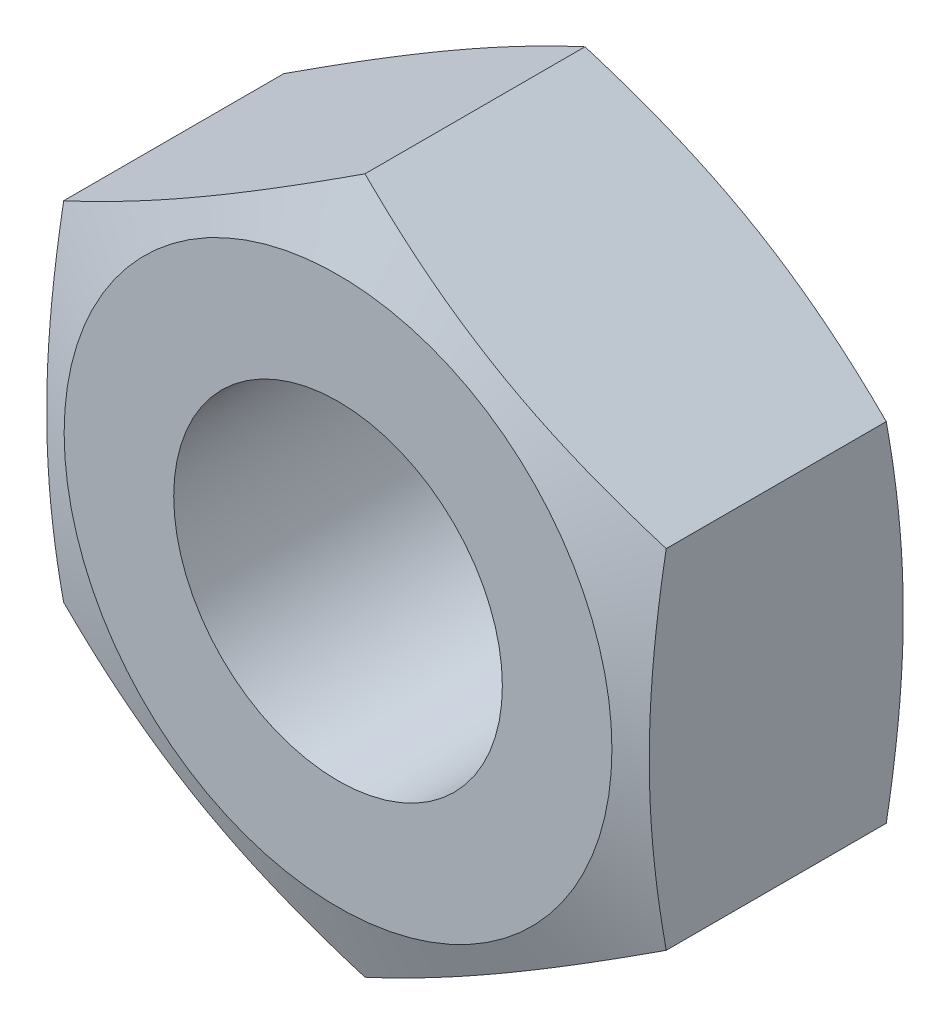
ISO-10303-21;
HEADER;
FILE_DESCRIPTION(('STEP AP214'),'2;1');
FILE_NAME('part.step','',(''),(''),'','','');
FILE_SCHEMA(('AUTOMOTIVE_DESIGN { 1 0 10303 214 1 1 1 1 }'));
ENDSEC;
DATA;
#1=APPLICATION_CONTEXT('core data for automotive mechanical design processes');
#2=APPLICATION_PROTOCOL_DEFINITION('international standard','automotive_design',2000,#1);
#3=PRODUCT_CONTEXT('',#1,'mechanical');
#4=PRODUCT('Part','Part','',(#3));
#5=PRODUCT_RELATED_PRODUCT_CATEGORY('part','',(#4));
#6=PRODUCT_DEFINITION_FORMATION('','',#4);
#7=PRODUCT_DEFINITION_CONTEXT('part definition',#1,'design');
#8=PRODUCT_DEFINITION('design','',#6,#7);
#9=PRODUCT_DEFINITION_SHAPE('','',#8);
#10=(LENGTH_UNIT() NAMED_UNIT(*) SI_UNIT(.MILLI.,.METRE.));
#11=(NAMED_UNIT(*) PLANE_ANGLE_UNIT() SI_UNIT($,.RADIAN.));
#12=(NAMED_UNIT(*) SI_UNIT($,.STERADIAN.) SOLID_ANGLE_UNIT());
#13=UNCERTAINTY_MEASURE_WITH_UNIT(LENGTH_MEASURE(1.E-05),#10,'distance_accuracy_value','');
#14=(GEOMETRIC_REPRESENTATION_CONTEXT(3) GLOBAL_UNCERTAINTY_ASSIGNED_CONTEXT((#13)) GLOBAL_UNIT_ASSIGNED_CONTEXT((#10,
#11,#12)) REPRESENTATION_CONTEXT('',''));
#15=CARTESIAN_POINT('',(0.,0.,0.));
#16=DIRECTION('',(0.,0.,1.));
#17=DIRECTION('',(1.,0.,0.));
#18=AXIS2_PLACEMENT_3D('',#15,#16,#17);
#19=CARTESIAN_POINT('',(0.,0.,-1.25));
#20=DIRECTION('',(0.,0.,1.));
#21=DIRECTION('',(1.,0.,0.));
#22=AXIS2_PLACEMENT_3D('',#19,#20,#21);
#23=PLANE('',#22);
#24=CARTESIAN_POINT('',(0.,0.,-1.25));
#25=DIRECTION('',(0.,0.,1.));
#26=DIRECTION('',(1.,0.,0.));
#27=AXIS2_PLACEMENT_3D('',#24,#25,#26);
#28=CIRCLE('',#27,1.5);
#29=CARTESIAN_POINT('',(1.5,0.,-1.25));
#30=VERTEX_POINT('',#29);
#31=EDGE_CURVE('E217',#30,#30,#28,.T.);
#32=ORIENTED_EDGE('',*,*,#31,.T.);
#33=EDGE_LOOP('',(#32));
#34=FACE_BOUND('',#33,.T.);
#35=CARTESIAN_POINT('',(0.,0.,-1.25));
#36=DIRECTION('',(0.,0.,1.));
#37=DIRECTION('',(1.,0.,0.));
#38=AXIS2_PLACEMENT_3D('',#35,#36,#37);
#39=CIRCLE('',#38,2.5);
#40=CARTESIAN_POINT('',(2.5,0.,-1.25));
#41=VERTEX_POINT('',#40);
#42=EDGE_CURVE('E100',#41,#41,#39,.T.);
#43=ORIENTED_EDGE('',*,*,#42,.F.);
#44=EDGE_LOOP('',(#43));
#45=FACE_BOUND('',#44,.T.);
#46=ADVANCED_FACE('F35',(#34,#45),#23,.F.);
#47=CARTESIAN_POINT('',(0.,0.,1.25));
#48=DIRECTION('',(0.,0.,1.));
#49=DIRECTION('',(1.,0.,0.));
#50=AXIS2_PLACEMENT_3D('',#47,#48,#49);
#51=PLANE('',#50);
#52=CARTESIAN_POINT('',(0.,0.,1.25));
#53=DIRECTION('',(0.,0.,1.));
#54=DIRECTION('',(1.,0.,0.));
#55=AXIS2_PLACEMENT_3D('',#52,#53,#54);
#56=CIRCLE('',#55,1.5);
#57=CARTESIAN_POINT('',(1.5,0.,1.25));
#58=VERTEX_POINT('',#57);
#59=EDGE_CURVE('E116',#58,#58,#56,.T.);
#60=ORIENTED_EDGE('',*,*,#59,.F.);
#61=EDGE_LOOP('',(#60));
#62=FACE_BOUND('',#61,.T.);
#63=CARTESIAN_POINT('',(0.,0.,1.25));
#64=DIRECTION('',(0.,0.,1.));
#65=DIRECTION('',(1.,0.,0.));
#66=AXIS2_PLACEMENT_3D('',#63,#64,#65);
#67=CIRCLE('',#66,2.5);
#68=CARTESIAN_POINT('',(2.5,0.,1.25));
#69=VERTEX_POINT('',#68);
#70=EDGE_CURVE('E136',#69,#69,#67,.T.);
#71=ORIENTED_EDGE('',*,*,#70,.T.);
#72=EDGE_LOOP('',(#71));
#73=FACE_BOUND('',#72,.T.);
#74=ADVANCED_FACE('F234',(#62,#73),#51,.T.);
#75=CARTESIAN_POINT('',(2.74999999999998,1.5877132402715,1.25));
#76=DIRECTION('',(-0.499999999999995,-0.866025403784442,0.));
#77=DIRECTION('',(0.866025403784442,-0.499999999999995,0.));
#78=AXIS2_PLACEMENT_3D('',#75,#76,#77);
#79=PLANE('',#78);
#80=DIRECTION('',(0.,0.,-1.));
#81=VECTOR('',#80,1.);
#82=CARTESIAN_POINT('',(2.74999999999998,1.5877132402715,1.25));
#83=LINE('',#82,#81);
#84=CARTESIAN_POINT('',(2.74999999999998,1.5877132402715,1.00416486564719));
#85=VERTEX_POINT('',#84);
#86=CARTESIAN_POINT('',(2.74999999999998,1.5877132402715,-1.00416486564719));
#87=VERTEX_POINT('',#86);
#88=EDGE_CURVE('E112',#85,#87,#83,.T.);
#89=ORIENTED_EDGE('',*,*,#88,.T.);
#90=CARTESIAN_POINT('',(2.75019999999998,1.58759777021766,-1.00412283569231));
#91=CARTESIAN_POINT('',(2.63630000012266,1.65335796580753,-1.02806806295923));
#92=CARTESIAN_POINT('',(2.52202437371802,1.71933502947406,-1.04985050676663));
#93=CARTESIAN_POINT('',(2.29272998795683,1.85171820481695,-1.08817348808627));
#94=CARTESIAN_POINT('',(2.17771071836235,1.91812461107932,-1.1047099225428));
#95=CARTESIAN_POINT('',(1.9482056761507,2.05062940898059,-1.13145718249891));
#96=CARTESIAN_POINT('',(1.83372514644429,2.11672477362355,-1.1417263556974));
#97=CARTESIAN_POINT('',(1.60449633341728,2.24907009053072,-1.1555002165376));
#98=CARTESIAN_POINT('',(1.48974816670863,2.31531997546897,-1.15900744143345));
#99=CARTESIAN_POINT('',(1.26025183329134,2.44781974534547,-1.15900744143345));
#100=CARTESIAN_POINT('',(1.1455036665827,2.51406963028372,-1.1555002165376));
#101=CARTESIAN_POINT('',(0.916274853555686,2.64641494719088,-1.1417263556974));
#102=CARTESIAN_POINT('',(0.801794323849274,2.71251031183385,-1.13145718249891));
#103=CARTESIAN_POINT('',(0.572289281637627,2.84501510973512,-1.1047099225428));
#104=CARTESIAN_POINT('',(0.457270012043149,2.91142151599748,-1.08817348808627));
#105=CARTESIAN_POINT('',(0.227975626281959,3.04380469134037,-1.04985050676663));
#106=CARTESIAN_POINT('',(0.113699999877319,3.10978175500691,-1.02806806295923));
#107=CARTESIAN_POINT('',(-0.000200000000000023,3.17554195059677,-1.00412283569231));
#108=B_SPLINE_CURVE_WITH_KNOTS('',3,(#90,#91,#92,#93,#94,#95,#96,#97,#98,#99,#100,#101,#102,
#103,#104,#105,#106,#107),.UNSPECIFIED.,.F.,.F.,(4,2,2,2,2,2,2,2,4),(0.,0.401088617558327,
0.80249016910686,1.20009530912775,1.59755122858029,1.99500714803282,2.39261228805371,
2.79401383960225,3.19510245716057),.UNSPECIFIED.);
#109=CARTESIAN_POINT('',(0.,3.17542648054294,-1.00416486564719));
#110=VERTEX_POINT('',#109);
#111=EDGE_CURVE('E57',#87,#110,#108,.T.);
#112=ORIENTED_EDGE('',*,*,#111,.T.);
#113=DIRECTION('',(0.,0.,-1.));
#114=VECTOR('',#113,1.);
#115=CARTESIAN_POINT('',(0.,3.17542648054294,1.25));
#116=LINE('',#115,#114);
#117=CARTESIAN_POINT('',(0.,3.17542648054294,1.00416486564719));
#118=VERTEX_POINT('',#117);
#119=EDGE_CURVE('E50',#118,#110,#116,.T.);
#120=ORIENTED_EDGE('',*,*,#119,.F.);
#121=CARTESIAN_POINT('',(2.75019999999998,1.58759777021766,1.00412283569231));
#122=CARTESIAN_POINT('',(2.63630000012266,1.65335796580753,1.02806806295923));
#123=CARTESIAN_POINT('',(2.52202437371802,1.71933502947406,1.04985050676663));
#124=CARTESIAN_POINT('',(2.29272998795683,1.85171820481695,1.08817348808627));
#125=CARTESIAN_POINT('',(2.17771071836235,1.91812461107932,1.1047099225428));
#126=CARTESIAN_POINT('',(1.9482056761507,2.05062940898059,1.13145718249891));
#127=CARTESIAN_POINT('',(1.83372514644429,2.11672477362355,1.1417263556974));
#128=CARTESIAN_POINT('',(1.60449633341728,2.24907009053072,1.1555002165376));
#129=CARTESIAN_POINT('',(1.48974816670863,2.31531997546897,1.15900744143345));
#130=CARTESIAN_POINT('',(1.26025183329134,2.44781974534547,1.15900744143345));
#131=CARTESIAN_POINT('',(1.1455036665827,2.51406963028372,1.1555002165376));
#132=CARTESIAN_POINT('',(0.916274853555686,2.64641494719088,1.1417263556974));
#133=CARTESIAN_POINT('',(0.801794323849274,2.71251031183385,1.13145718249891));
#134=CARTESIAN_POINT('',(0.572289281637627,2.84501510973512,1.1047099225428));
#135=CARTESIAN_POINT('',(0.457270012043149,2.91142151599748,1.08817348808627));
#136=CARTESIAN_POINT('',(0.227975626281959,3.04380469134037,1.04985050676663));
#137=CARTESIAN_POINT('',(0.113699999877319,3.10978175500691,1.02806806295923));
#138=CARTESIAN_POINT('',(-0.000200000000000023,3.17554195059677,1.00412283569231));
#139=B_SPLINE_CURVE_WITH_KNOTS('',3,(#121,#122,#123,#124,#125,#126,#127,#128,#129,#130,#131,
#132,#133,#134,#135,#136,#137,#138),.UNSPECIFIED.,.F.,.F.,(4,2,2,2,2,2,2,2,4),(0.,
0.401088617558327,0.80249016910686,1.20009530912775,1.59755122858029,1.99500714803282,
2.39261228805371,2.79401383960225,3.19510245716057),.UNSPECIFIED.);
#140=EDGE_CURVE('E135',#85,#118,#139,.T.);
#141=ORIENTED_EDGE('',*,*,#140,.F.);
#142=EDGE_LOOP('',(#89,#112,#120,#141));
#143=FACE_BOUND('',#142,.T.);
#144=ADVANCED_FACE('F37',(#143),#79,.F.);
#145=CARTESIAN_POINT('',(0.,3.17542648054294,1.25));
#146=DIRECTION('',(0.500000000000001,-0.866025403784438,0.));
#147=DIRECTION('',(0.866025403784438,0.500000000000001,0.));
#148=AXIS2_PLACEMENT_3D('',#145,#146,#147);
#149=PLANE('',#148);
#150=ORIENTED_EDGE('',*,*,#119,.T.);
#151=CARTESIAN_POINT('',(0.000200000000000055,3.17554195059677,-1.00412283569231));
#152=CARTESIAN_POINT('',(-0.113699999877319,3.10978175500691,-1.02806806295923));
#153=CARTESIAN_POINT('',(-0.227975626281961,3.04380469134037,-1.04985050676663));
#154=CARTESIAN_POINT('',(-0.457270012043153,2.91142151599748,-1.08817348808627));
#155=CARTESIAN_POINT('',(-0.572289281637632,2.84501510973511,-1.10470992254281));
#156=CARTESIAN_POINT('',(-0.801794323849281,2.71251031183384,-1.13145718249891));
#157=CARTESIAN_POINT('',(-0.916274853555694,2.64641494719087,-1.1417263556974));
#158=CARTESIAN_POINT('',(-1.14550366658271,2.5140696302837,-1.15550021653761));
#159=CARTESIAN_POINT('',(-1.26025183329135,2.44781974534545,-1.15900744143345));
#160=CARTESIAN_POINT('',(-1.48974816670865,2.31531997546895,-1.15900744143345));
#161=CARTESIAN_POINT('',(-1.60449633341729,2.24907009053069,-1.15550021653761));
#162=CARTESIAN_POINT('',(-1.83372514644431,2.11672477362353,-1.1417263556974));
#163=CARTESIAN_POINT('',(-1.94820567615072,2.05062940898056,-1.13145718249891));
#164=CARTESIAN_POINT('',(-2.17771071836237,1.91812461107929,-1.10470992254281));
#165=CARTESIAN_POINT('',(-2.29272998795685,1.85171820481692,-1.08817348808627));
#166=CARTESIAN_POINT('',(-2.52202437371804,1.71933502947403,-1.04985050676663));
#167=CARTESIAN_POINT('',(-2.63630000012268,1.65335796580749,-1.02806806295923));
#168=CARTESIAN_POINT('',(-2.7502,1.58759777021762,-1.00412283569231));
#169=B_SPLINE_CURVE_WITH_KNOTS('',3,(#151,#152,#153,#154,#155,#156,#157,#158,#159,#160,#161,
#162,#163,#164,#165,#166,#167,#168),.UNSPECIFIED.,.F.,.F.,(4,2,2,2,2,2,2,2,4),(0.,
0.401088617558332,0.80249016910687,1.20009530912777,1.59755122858031,1.99500714803284,
2.39261228805374,2.79401383960228,3.19510245716061),.UNSPECIFIED.);
#170=CARTESIAN_POINT('',(-2.75,1.58771324027146,-1.00416486564719));
#171=VERTEX_POINT('',#170);
#172=EDGE_CURVE('E131',#110,#171,#169,.T.);
#173=ORIENTED_EDGE('',*,*,#172,.T.);
#174=DIRECTION('',(0.,0.,-1.));
#175=VECTOR('',#174,1.);
#176=CARTESIAN_POINT('',(-2.75,1.58771324027146,1.25));
#177=LINE('',#176,#175);
#178=CARTESIAN_POINT('',(-2.75,1.58771324027146,1.00416486564719));
#179=VERTEX_POINT('',#178);
#180=EDGE_CURVE('E122',#179,#171,#177,.T.);
#181=ORIENTED_EDGE('',*,*,#180,.F.);
#182=CARTESIAN_POINT('',(0.000200000000000055,3.17554195059677,1.00412283569231));
#183=CARTESIAN_POINT('',(-0.113699999877319,3.10978175500691,1.02806806295923));
#184=CARTESIAN_POINT('',(-0.227975626281961,3.04380469134037,1.04985050676663));
#185=CARTESIAN_POINT('',(-0.457270012043153,2.91142151599748,1.08817348808627));
#186=CARTESIAN_POINT('',(-0.572289281637632,2.84501510973511,1.10470992254281));
#187=CARTESIAN_POINT('',(-0.801794323849281,2.71251031183384,1.13145718249891));
#188=CARTESIAN_POINT('',(-0.916274853555694,2.64641494719087,1.1417263556974));
#189=CARTESIAN_POINT('',(-1.14550366658271,2.5140696302837,1.15550021653761));
#190=CARTESIAN_POINT('',(-1.26025183329135,2.44781974534545,1.15900744143345));
#191=CARTESIAN_POINT('',(-1.48974816670865,2.31531997546895,1.15900744143345));
#192=CARTESIAN_POINT('',(-1.60449633341729,2.24907009053069,1.15550021653761));
#193=CARTESIAN_POINT('',(-1.83372514644431,2.11672477362353,1.1417263556974));
#194=CARTESIAN_POINT('',(-1.94820567615072,2.05062940898056,1.13145718249891));
#195=CARTESIAN_POINT('',(-2.17771071836237,1.91812461107929,1.10470992254281));
#196=CARTESIAN_POINT('',(-2.29272998795685,1.85171820481692,1.08817348808627));
#197=CARTESIAN_POINT('',(-2.52202437371804,1.71933502947403,1.04985050676663));
#198=CARTESIAN_POINT('',(-2.63630000012268,1.65335796580749,1.02806806295923));
#199=CARTESIAN_POINT('',(-2.7502,1.58759777021762,1.00412283569231));
#200=B_SPLINE_CURVE_WITH_KNOTS('',3,(#182,#183,#184,#185,#186,#187,#188,#189,#190,#191,#192,
#193,#194,#195,#196,#197,#198,#199),.UNSPECIFIED.,.F.,.F.,(4,2,2,2,2,2,2,2,4),(0.,
0.401088617558332,0.80249016910687,1.20009530912777,1.59755122858031,1.99500714803284,
2.39261228805374,2.79401383960228,3.19510245716061),.UNSPECIFIED.);
#201=EDGE_CURVE('E132',#118,#179,#200,.T.);
#202=ORIENTED_EDGE('',*,*,#201,.F.);
#203=EDGE_LOOP('',(#150,#173,#181,#202));
#204=FACE_BOUND('',#203,.T.);
#205=ADVANCED_FACE('F129',(#204),#149,.F.);
#206=CARTESIAN_POINT('',(-2.75,1.58771324027146,1.25));
#207=DIRECTION('',(1.,0.,0.));
#208=DIRECTION('',(0.,1.,0.));
#209=AXIS2_PLACEMENT_3D('',#206,#207,#208);
#210=PLANE('',#209);
#211=ORIENTED_EDGE('',*,*,#180,.T.);
#212=CARTESIAN_POINT('',(-2.75000000000001,5.57371933016283,0.102226200359517));
#213=CARTESIAN_POINT('',(-2.75000000000001,5.36029018175451,0.0326060149718411));
#214=CARTESIAN_POINT('',(-2.75000000000001,5.14664885819299,-0.0363834016424199));
#215=CARTESIAN_POINT('',(-2.75000000000001,4.71871301637861,-0.172450723804646));
#216=CARTESIAN_POINT('',(-2.75000000000001,4.5044183775409,-0.239528249437278));
#217=CARTESIAN_POINT('',(-2.75000000000001,4.07156734633472,-0.372155134515592));
#218=CARTESIAN_POINT('',(-2.75000000000001,3.85299797625181,-0.437662378897746));
#219=CARTESIAN_POINT('',(-2.75,3.41475677078908,-0.564858987942426));
#220=CARTESIAN_POINT('',(-2.75,3.19508500157893,-0.626548578858859));
#221=CARTESIAN_POINT('',(-2.75,2.7647305544653,-0.741565674943323));
#222=CARTESIAN_POINT('',(-2.75,2.55411776513824,-0.795151451148377));
#223=CARTESIAN_POINT('',(-2.75,2.13109495291626,-0.894999836174153));
#224=CARTESIAN_POINT('',(-2.75,1.91868459709076,-0.941261055681161));
#225=CARTESIAN_POINT('',(-2.75,1.49349158928842,-1.02280161144137));
#226=CARTESIAN_POINT('',(-2.75,1.28072640302065,-1.05816823359827));
#227=CARTESIAN_POINT('',(-2.75,0.960188486488225,-1.10036899616994));
#228=CARTESIAN_POINT('',(-2.75,0.853127685487275,-1.11262665220212));
#229=CARTESIAN_POINT('',(-2.75,0.638621889267657,-1.13306303069527));
#230=CARTESIAN_POINT('',(-2.75,0.531176934644507,-1.14124217202949));
#231=CARTESIAN_POINT('',(-2.74999999999999,0.310191929138993,-1.15348603076623));
#232=CARTESIAN_POINT('',(-2.74999999999999,0.196637883031659,-1.15730306800252));
#233=CARTESIAN_POINT('',(-2.74999999999999,-0.030527201683415,-1.15979902817189));
#234=CARTESIAN_POINT('',(-2.74999999999999,-0.144138240236943,-1.15847795598323));
#235=CARTESIAN_POINT('',(-2.74999999999999,-0.371220004015234,-1.15076810041366));
#236=CARTESIAN_POINT('',(-2.74999999999999,-0.484690676958371,-1.14437779774656));
#237=CARTESIAN_POINT('',(-2.74999999999999,-0.711260133369567,-1.12685765995097));
#238=CARTESIAN_POINT('',(-2.74999999999999,-0.8243589074451,-1.11572770603229));
#239=CARTESIAN_POINT('',(-2.74999999999999,-1.1640025096968,-1.07584739924237));
#240=CARTESIAN_POINT('',(-2.74999999999999,-1.38979392723654,-1.04065249802705));
#241=CARTESIAN_POINT('',(-2.74999999999999,-1.83903369209839,-0.957897994883955));
#242=CARTESIAN_POINT('',(-2.74999999999999,-2.0624815011051,-0.910335614226457));
#243=CARTESIAN_POINT('',(-2.74999999999998,-2.50807453131691,-0.806683447209292));
#244=CARTESIAN_POINT('',(-2.74999999999998,-2.73021370371434,-0.750568103081424));
#245=CARTESIAN_POINT('',(-2.74999999999998,-3.17292620943466,-0.632671141094055));
#246=CARTESIAN_POINT('',(-2.74999999999998,-3.39349976875594,-0.570890359738486));
#247=CARTESIAN_POINT('',(-2.74999999999998,-3.83315554168244,-0.443547003153363));
#248=CARTESIAN_POINT('',(-2.74999999999998,-4.05223959661126,-0.377990738221466));
#249=CARTESIAN_POINT('',(-2.74999999999998,-4.48957276395999,-0.244156460392874));
#250=CARTESIAN_POINT('',(-2.74999999999998,-4.7078218704135,-0.175878428086559));
#251=CARTESIAN_POINT('',(-2.74999999999998,-4.97991112819676,-0.089407457531014));
#252=CARTESIAN_POINT('',(-2.74999999999998,-5.03404606803872,-0.0721363430527247));
#253=CARTESIAN_POINT('',(-2.74999999999998,-5.14228497275033,-0.0374788040378969));
#254=CARTESIAN_POINT('',(-2.74999999999998,-5.19638893403462,-0.0200923682864451));
#255=CARTESIAN_POINT('',(-2.74999999999998,-5.30438463452546,0.0147279194418513));
#256=CARTESIAN_POINT('',(-2.74999999999998,-5.35827648519158,0.0321614259640328));
#257=CARTESIAN_POINT('',(-2.74999999999998,-5.46602354811423,0.0671237426832661));
#258=CARTESIAN_POINT('',(-2.74999999999997,-5.51987876339116,0.0846525435713418));
#259=CARTESIAN_POINT('',(-2.74999999999997,-5.57371933016285,0.102226200359517));
#260=B_SPLINE_CURVE_WITH_KNOTS('',3,(#212,#213,#214,#215,#216,#217,#218,#219,#220,#221,#222,
#223,#224,#225,#226,#227,#228,#229,#230,#231,#232,#233,#234,#235,#236,#237,#238,#239,#240,#241,
#242,#243,#244,#245,#246,#247,#248,#249,#250,#251,#252,#253,#254,#255,#256,#257,#258,#259),
.UNSPECIFIED.,.F.,.F.,(4,2,2,2,2,2,2,2,2,2,2,2,2,2,2,2,2,2,2,2,2,2,2,4),(0.,0.673499680821791,
1.34713227391939,2.03163306387696,2.71609324784758,3.36797049731626,4.01997124638481,
4.66660357885425,4.98981861275837,5.31300044486247,5.65374079387191,5.99448081937375,
6.33532300580423,6.67617373528742,7.36117065134882,8.04632160594806,8.73356157476028,
9.42070023521265,10.1067219946591,10.7927486471777,10.9632184410588,11.1337050634473,
11.3036294555609,11.4735375363863),.UNSPECIFIED.);
#261=CARTESIAN_POINT('',(-2.74999999999999,-1.58771324027148,-1.00416486564719));
#262=VERTEX_POINT('',#261);
#263=EDGE_CURVE('E140',#171,#262,#260,.T.);
#264=ORIENTED_EDGE('',*,*,#263,.T.);
#265=DIRECTION('',(0.,0.,-1.));
#266=VECTOR('',#265,1.);
#267=CARTESIAN_POINT('',(-2.74999999999999,-1.58771324027148,1.25));
#268=LINE('',#267,#266);
#269=CARTESIAN_POINT('',(-2.74999999999999,-1.58771324027148,1.00416486564719));
#270=VERTEX_POINT('',#269);
#271=EDGE_CURVE('E114',#270,#262,#268,.T.);
#272=ORIENTED_EDGE('',*,*,#271,.F.);
#273=CARTESIAN_POINT('',(-2.75000000000001,5.59498963776656,-0.109171493266595));
#274=CARTESIAN_POINT('',(-2.75000000000001,5.38086588098911,-0.0392726149483082));
#275=CARTESIAN_POINT('',(-2.75000000000001,5.16653049203581,0.0299974854342311));
#276=CARTESIAN_POINT('',(-2.75000000000001,4.7372074540228,0.166631138035061));
#277=CARTESIAN_POINT('',(-2.75000000000001,4.5222196847793,0.233994311952252));
#278=CARTESIAN_POINT('',(-2.75000000000001,4.08795878081958,0.367207127618941));
#279=CARTESIAN_POINT('',(-2.75000000000001,3.86867263305894,0.433014587238129));
#280=CARTESIAN_POINT('',(-2.75,3.42899827537259,0.560817700775031));
#281=CARTESIAN_POINT('',(-2.75,3.20861013255148,0.622813583809489));
#282=CARTESIAN_POINT('',(-2.75,2.77689430163156,0.738422692928419));
#283=CARTESIAN_POINT('',(-2.75,2.56563683315127,0.792294909748144));
#284=CARTESIAN_POINT('',(-2.75,2.14131947799161,0.892717495777751));
#285=CARTESIAN_POINT('',(-2.75,1.92825925156246,0.939266450921717));
#286=CARTESIAN_POINT('',(-2.75,1.5017703263654,1.02136406862253));
#287=CARTESIAN_POINT('',(-2.75,1.28835927581929,1.05700059655695));
#288=CARTESIAN_POINT('',(-2.75,0.966840039722671,1.09957067163416));
#289=CARTESIAN_POINT('',(-2.75,0.85945032738111,1.11194547716223));
#290=CARTESIAN_POINT('',(-2.75,0.644282131815492,1.13259825140547));
#291=CARTESIAN_POINT('',(-2.75,0.536503689969622,1.14087664391124));
#292=CARTESIAN_POINT('',(-2.74999999999999,0.314791205317475,1.15330211597228));
#293=CARTESIAN_POINT('',(-2.74999999999999,0.20084283425308,1.15719853214001));
#294=CARTESIAN_POINT('',(-2.74999999999999,-0.027113908393681,1.15981794017137));
#295=CARTESIAN_POINT('',(-2.74999999999999,-0.141122279898163,1.15854093873386));
#296=CARTESIAN_POINT('',(-2.74999999999999,-0.368999396162611,1.15088203402448));
#297=CARTESIAN_POINT('',(-2.74999999999999,-0.482868088638719,1.14449859608391));
#298=CARTESIAN_POINT('',(-2.74999999999999,-0.710231689372137,1.12695709952214));
#299=CARTESIAN_POINT('',(-2.74999999999999,-0.823726588007371,1.11579891894429));
#300=CARTESIAN_POINT('',(-2.74999999999999,-1.16456186725235,1.07578780110473));
#301=CARTESIAN_POINT('',(-2.74999999999999,-1.39114352093705,1.04044421464097));
#302=CARTESIAN_POINT('',(-2.74999999999999,-1.84194802331645,0.957320196332821));
#303=CARTESIAN_POINT('',(-2.74999999999999,-2.06617031899214,0.909536913409415));
#304=CARTESIAN_POINT('',(-2.74999999999998,-2.51330524856855,0.805406052804202));
#305=CARTESIAN_POINT('',(-2.74999999999998,-2.7362117875455,0.749032753352842));
#306=CARTESIAN_POINT('',(-2.74999999999998,-3.18045209645662,0.630603166862518));
#307=CARTESIAN_POINT('',(-2.74999999999998,-3.40178609723777,0.568547733339631));
#308=CARTESIAN_POINT('',(-2.74999999999998,-3.84295657016727,0.440648591361564));
#309=CARTESIAN_POINT('',(-2.74999999999998,-4.06279489780973,0.374811235975386));
#310=CARTESIAN_POINT('',(-2.74999999999998,-4.50163518982051,0.240411808090267));
#311=CARTESIAN_POINT('',(-2.74999999999998,-4.72063714773559,0.171849714614204));
#312=CARTESIAN_POINT('',(-2.74999999999998,-4.99412405014673,0.0848778472018716));
#313=CARTESIAN_POINT('',(-2.74999999999998,-5.04890377131261,0.0673892872843972));
#314=CARTESIAN_POINT('',(-2.74999999999998,-5.15843175531914,0.0322949224674986));
#315=CARTESIAN_POINT('',(-2.74999999999998,-5.21318001445696,0.0146891059938044));
#316=CARTESIAN_POINT('',(-2.74999999999998,-5.32245952027236,-0.0205701988646663));
#317=CARTESIAN_POINT('',(-2.74999999999998,-5.37699088157495,-0.038223332237118));
#318=CARTESIAN_POINT('',(-2.74999999999998,-5.48601632857604,-0.0736263162742518));
#319=CARTESIAN_POINT('',(-2.74999999999997,-5.5405104173888,-0.0913761573476796));
#320=CARTESIAN_POINT('',(-2.74999999999997,-5.59498963776658,-0.109171493266595));
#321=B_SPLINE_CURVE_WITH_KNOTS('',3,(#273,#274,#275,#276,#277,#278,#279,#280,#281,#282,#283,
#284,#285,#286,#287,#288,#289,#290,#291,#292,#293,#294,#295,#296,#297,#298,#299,#300,#301,#302,
#303,#304,#305,#306,#307,#308,#309,#310,#311,#312,#313,#314,#315,#316,#317,#318,#319,#320),
.UNSPECIFIED.,.F.,.F.,(4,2,2,2,2,2,2,2,2,2,2,2,2,2,2,2,2,2,2,2,2,2,2,4),(0.,0.675740010224306,
1.3516131492006,2.03843252856819,2.72521058225814,3.37917450674758,4.03326455210197,
4.6819403766504,5.00617545844672,5.33037698978778,5.67230660816512,6.01423578379049,
6.3562677601135,6.69830847315129,7.38571104990266,8.07327131274381,8.76293238899559,
9.4524900403407,10.1409214136402,10.8293580880391,11.0018689876541,11.1743971757563,
11.346349762258,11.518285594536),.UNSPECIFIED.);
#322=EDGE_CURVE('E195',#179,#270,#321,.T.);
#323=ORIENTED_EDGE('',*,*,#322,.F.);
#324=EDGE_LOOP('',(#211,#264,#272,#323));
#325=FACE_BOUND('',#324,.T.);
#326=ADVANCED_FACE('F186',(#325),#210,.F.);
#327=CARTESIAN_POINT('',(-2.74999999999999,-1.58771324027148,1.25));
#328=DIRECTION('',(0.499999999999995,0.866025403784442,0.));
#329=DIRECTION('',(-0.866025403784442,0.499999999999995,0.));
#330=AXIS2_PLACEMENT_3D('',#327,#328,#329);
#331=PLANE('',#330);
#332=ORIENTED_EDGE('',*,*,#271,.T.);
#333=CARTESIAN_POINT('',(-2.75019999999999,-1.58759777021764,-1.00412283569231));
#334=CARTESIAN_POINT('',(-2.63630000012267,-1.65335796580751,-1.02806806295923));
#335=CARTESIAN_POINT('',(-2.52202437371803,-1.71933502947404,-1.04985050676663));
#336=CARTESIAN_POINT('',(-2.29272998795683,-1.85171820481694,-1.08817348808627));
#337=CARTESIAN_POINT('',(-2.17771071836235,-1.9181246110793,-1.10470992254281));
#338=CARTESIAN_POINT('',(-1.9482056761507,-2.05062940898057,-1.13145718249891));
#339=CARTESIAN_POINT('',(-1.83372514644429,-2.11672477362354,-1.1417263556974));
#340=CARTESIAN_POINT('',(-1.60449633341728,-2.2490700905307,-1.15550021653761));
#341=CARTESIAN_POINT('',(-1.48974816670863,-2.31531997546896,-1.15900744143345));
#342=CARTESIAN_POINT('',(-1.26025183329134,-2.44781974534546,-1.15900744143345));
#343=CARTESIAN_POINT('',(-1.14550366658269,-2.51406963028371,-1.15550021653761));
#344=CARTESIAN_POINT('',(-0.916274853555675,-2.64641494719088,-1.1417263556974));
#345=CARTESIAN_POINT('',(-0.801794323849262,-2.71251031183384,-1.13145718249891));
#346=CARTESIAN_POINT('',(-0.572289281637612,-2.84501510973511,-1.10470992254281));
#347=CARTESIAN_POINT('',(-0.457270012043133,-2.91142151599748,-1.08817348808627));
#348=CARTESIAN_POINT('',(-0.22797562628194,-3.04380469134037,-1.04985050676663));
#349=CARTESIAN_POINT('',(-0.113699999877298,-3.10978175500691,-1.02806806295923));
#350=CARTESIAN_POINT('',(0.000200000000022081,-3.17554195059677,-1.00412283569231));
#351=B_SPLINE_CURVE_WITH_KNOTS('',3,(#333,#334,#335,#336,#337,#338,#339,#340,#341,#342,#343,
#344,#345,#346,#347,#348,#349,#350),.UNSPECIFIED.,.F.,.F.,(4,2,2,2,2,2,2,2,4),(0.,
0.401088617558331,0.80249016910687,1.20009530912777,1.59755122858031,1.99500714803284,
2.39261228805374,2.79401383960228,3.19510245716061),.UNSPECIFIED.);
#352=CARTESIAN_POINT('',(0.,-3.17542648054294,-1.00416486564719));
#353=VERTEX_POINT('',#352);
#354=EDGE_CURVE('E109',#262,#353,#351,.T.);
#355=ORIENTED_EDGE('',*,*,#354,.T.);
#356=DIRECTION('',(0.,0.,-1.));
#357=VECTOR('',#356,1.);
#358=CARTESIAN_POINT('',(0.,-3.17542648054294,1.25));
#359=LINE('',#358,#357);
#360=CARTESIAN_POINT('',(0.,-3.17542648054294,1.00416486564719));
#361=VERTEX_POINT('',#360);
#362=EDGE_CURVE('E108',#361,#353,#359,.T.);
#363=ORIENTED_EDGE('',*,*,#362,.F.);
#364=CARTESIAN_POINT('',(-2.75019999999999,-1.58759777021764,1.00412283569231));
#365=CARTESIAN_POINT('',(-2.63630000012267,-1.65335796580751,1.02806806295923));
#366=CARTESIAN_POINT('',(-2.52202437371803,-1.71933502947404,1.04985050676663));
#367=CARTESIAN_POINT('',(-2.29272998795683,-1.85171820481694,1.08817348808627));
#368=CARTESIAN_POINT('',(-2.17771071836235,-1.9181246110793,1.10470992254281));
#369=CARTESIAN_POINT('',(-1.9482056761507,-2.05062940898057,1.13145718249891));
#370=CARTESIAN_POINT('',(-1.83372514644429,-2.11672477362354,1.1417263556974));
#371=CARTESIAN_POINT('',(-1.60449633341728,-2.2490700905307,1.15550021653761));
#372=CARTESIAN_POINT('',(-1.48974816670863,-2.31531997546896,1.15900744143345));
#373=CARTESIAN_POINT('',(-1.26025183329134,-2.44781974534546,1.15900744143345));
#374=CARTESIAN_POINT('',(-1.14550366658269,-2.51406963028371,1.15550021653761));
#375=CARTESIAN_POINT('',(-0.916274853555675,-2.64641494719088,1.1417263556974));
#376=CARTESIAN_POINT('',(-0.801794323849262,-2.71251031183384,1.13145718249891));
#377=CARTESIAN_POINT('',(-0.572289281637612,-2.84501510973511,1.10470992254281));
#378=CARTESIAN_POINT('',(-0.457270012043133,-2.91142151599748,1.08817348808627));
#379=CARTESIAN_POINT('',(-0.22797562628194,-3.04380469134037,1.04985050676663));
#380=CARTESIAN_POINT('',(-0.113699999877298,-3.10978175500691,1.02806806295923));
#381=CARTESIAN_POINT('',(0.000200000000022081,-3.17554195059677,1.00412283569231));
#382=B_SPLINE_CURVE_WITH_KNOTS('',3,(#364,#365,#366,#367,#368,#369,#370,#371,#372,#373,#374,
#375,#376,#377,#378,#379,#380,#381),.UNSPECIFIED.,.F.,.F.,(4,2,2,2,2,2,2,2,4),(0.,
0.401088617558331,0.80249016910687,1.20009530912777,1.59755122858031,1.99500714803284,
2.39261228805374,2.79401383960228,3.19510245716061),.UNSPECIFIED.);
#383=EDGE_CURVE('E202',#270,#361,#382,.T.);
#384=ORIENTED_EDGE('',*,*,#383,.F.);
#385=EDGE_LOOP('',(#332,#355,#363,#384));
#386=FACE_BOUND('',#385,.T.);
#387=ADVANCED_FACE('F189',(#386),#331,.F.);
#388=CARTESIAN_POINT('',(0.,-3.17542648054294,1.25));
#389=DIRECTION('',(-0.500000000000007,0.866025403784435,0.));
#390=DIRECTION('',(-0.866025403784435,-0.500000000000007,0.));
#391=AXIS2_PLACEMENT_3D('',#388,#389,#390);
#392=PLANE('',#391);
#393=ORIENTED_EDGE('',*,*,#362,.T.);
#394=CARTESIAN_POINT('',(-0.000199999999977867,-3.17554195059677,-1.00412283569231));
#395=CARTESIAN_POINT('',(0.113699999877341,-3.1097817550069,-1.02806806295923));
#396=CARTESIAN_POINT('',(0.227975626281982,-3.04380469134037,-1.04985050676663));
#397=CARTESIAN_POINT('',(0.457270012043174,-2.91142151599747,-1.08817348808627));
#398=CARTESIAN_POINT('',(0.572289281637652,-2.84501510973511,-1.10470992254281));
#399=CARTESIAN_POINT('',(0.8017943238493,-2.71251031183383,-1.13145718249891));
#400=CARTESIAN_POINT('',(0.916274853555712,-2.64641494719086,-1.1417263556974));
#401=CARTESIAN_POINT('',(1.14550366658272,-2.5140696302837,-1.15550021653761));
#402=CARTESIAN_POINT('',(1.26025183329137,-2.44781974534544,-1.15900744143345));
#403=CARTESIAN_POINT('',(1.48974816670866,-2.31531997546894,-1.15900744143345));
#404=CARTESIAN_POINT('',(1.60449633341731,-2.24907009053068,-1.15550021653761));
#405=CARTESIAN_POINT('',(1.83372514644432,-2.11672477362351,-1.1417263556974));
#406=CARTESIAN_POINT('',(1.94820567615073,-2.05062940898055,-1.13145718249891));
#407=CARTESIAN_POINT('',(2.17771071836238,-1.91812461107927,-1.10470992254281));
#408=CARTESIAN_POINT('',(2.29272998795686,-1.8517182048169,-1.08817348808627));
#409=CARTESIAN_POINT('',(2.52202437371805,-1.71933502947401,-1.04985050676663));
#410=CARTESIAN_POINT('',(2.63630000012269,-1.65335796580747,-1.02806806295923));
#411=CARTESIAN_POINT('',(2.75020000000001,-1.5875977702176,-1.00412283569231));
#412=B_SPLINE_CURVE_WITH_KNOTS('',3,(#394,#395,#396,#397,#398,#399,#400,#401,#402,#403,#404,
#405,#406,#407,#408,#409,#410,#411),.UNSPECIFIED.,.F.,.F.,(4,2,2,2,2,2,2,2,4),(0.,
0.401088617558332,0.80249016910687,1.20009530912777,1.59755122858031,1.99500714803284,
2.39261228805374,2.79401383960228,3.19510245716061),.UNSPECIFIED.);
#413=CARTESIAN_POINT('',(2.75000000000001,-1.58771324027144,-1.00416486564719));
#414=VERTEX_POINT('',#413);
#415=EDGE_CURVE('E94',#353,#414,#412,.T.);
#416=ORIENTED_EDGE('',*,*,#415,.T.);
#417=DIRECTION('',(0.,0.,-1.));
#418=VECTOR('',#417,1.);
#419=CARTESIAN_POINT('',(2.75000000000001,-1.58771324027144,1.25));
#420=LINE('',#419,#418);
#421=CARTESIAN_POINT('',(2.75000000000001,-1.58771324027144,1.00416486564719));
#422=VERTEX_POINT('',#421);
#423=EDGE_CURVE('E106',#422,#414,#420,.T.);
#424=ORIENTED_EDGE('',*,*,#423,.F.);
#425=CARTESIAN_POINT('',(-0.000199999999977867,-3.17554195059677,1.00412283569231));
#426=CARTESIAN_POINT('',(0.113699999877341,-3.1097817550069,1.02806806295923));
#427=CARTESIAN_POINT('',(0.227975626281982,-3.04380469134037,1.04985050676663));
#428=CARTESIAN_POINT('',(0.457270012043174,-2.91142151599747,1.08817348808627));
#429=CARTESIAN_POINT('',(0.572289281637652,-2.84501510973511,1.10470992254281));
#430=CARTESIAN_POINT('',(0.8017943238493,-2.71251031183383,1.13145718249891));
#431=CARTESIAN_POINT('',(0.916274853555712,-2.64641494719086,1.1417263556974));
#432=CARTESIAN_POINT('',(1.14550366658272,-2.5140696302837,1.15550021653761));
#433=CARTESIAN_POINT('',(1.26025183329137,-2.44781974534544,1.15900744143345));
#434=CARTESIAN_POINT('',(1.48974816670866,-2.31531997546894,1.15900744143345));
#435=CARTESIAN_POINT('',(1.60449633341731,-2.24907009053068,1.15550021653761));
#436=CARTESIAN_POINT('',(1.83372514644432,-2.11672477362351,1.1417263556974));
#437=CARTESIAN_POINT('',(1.94820567615073,-2.05062940898055,1.13145718249891));
#438=CARTESIAN_POINT('',(2.17771071836238,-1.91812461107927,1.10470992254281));
#439=CARTESIAN_POINT('',(2.29272998795686,-1.8517182048169,1.08817348808627));
#440=CARTESIAN_POINT('',(2.52202437371805,-1.71933502947401,1.04985050676663));
#441=CARTESIAN_POINT('',(2.63630000012269,-1.65335796580747,1.02806806295923));
#442=CARTESIAN_POINT('',(2.75020000000001,-1.5875977702176,1.00412283569231));
#443=B_SPLINE_CURVE_WITH_KNOTS('',3,(#425,#426,#427,#428,#429,#430,#431,#432,#433,#434,#435,
#436,#437,#438,#439,#440,#441,#442),.UNSPECIFIED.,.F.,.F.,(4,2,2,2,2,2,2,2,4),(0.,
0.401088617558332,0.80249016910687,1.20009530912777,1.59755122858031,1.99500714803284,
2.39261228805374,2.79401383960228,3.19510245716061),.UNSPECIFIED.);
#444=EDGE_CURVE('E64',#361,#422,#443,.T.);
#445=ORIENTED_EDGE('',*,*,#444,.F.);
#446=EDGE_LOOP('',(#393,#416,#424,#445));
#447=FACE_BOUND('',#446,.T.);
#448=ADVANCED_FACE('F105',(#447),#392,.F.);
#449=CARTESIAN_POINT('',(2.75000000000001,-1.58771324027144,1.25));
#450=DIRECTION('',(-1.,0.,0.));
#451=DIRECTION('',(0.,-1.,0.));
#452=AXIS2_PLACEMENT_3D('',#449,#450,#451);
#453=PLANE('',#452);
#454=ORIENTED_EDGE('',*,*,#423,.T.);
#455=CARTESIAN_POINT('',(2.75000000000005,-5.57371933016281,0.102226200359517));
#456=CARTESIAN_POINT('',(2.75000000000005,-5.36029018175449,0.0326060149718414));
#457=CARTESIAN_POINT('',(2.75000000000005,-5.14664885819297,-0.0363834016424196));
#458=CARTESIAN_POINT('',(2.75000000000004,-4.71871301637859,-0.172450723804646));
#459=CARTESIAN_POINT('',(2.75000000000004,-4.50441837754089,-0.239528249437278));
#460=CARTESIAN_POINT('',(2.75000000000004,-4.0715673463347,-0.372155134515592));
#461=CARTESIAN_POINT('',(2.75000000000003,-3.85299797625179,-0.437662378897746));
#462=CARTESIAN_POINT('',(2.75000000000003,-3.41475677078906,-0.564858987942426));
#463=CARTESIAN_POINT('',(2.75000000000003,-3.19508500157891,-0.626548578858859));
#464=CARTESIAN_POINT('',(2.75000000000002,-2.76473055446528,-0.741565674943323));
#465=CARTESIAN_POINT('',(2.75000000000002,-2.55411776513822,-0.795151451148377));
#466=CARTESIAN_POINT('',(2.75000000000002,-2.13109495291624,-0.894999836174153));
#467=CARTESIAN_POINT('',(2.75000000000001,-1.91868459709075,-0.941261055681161));
#468=CARTESIAN_POINT('',(2.75000000000001,-1.4934915892884,-1.02280161144137));
#469=CARTESIAN_POINT('',(2.75000000000001,-1.28072640302063,-1.05816823359827));
#470=CARTESIAN_POINT('',(2.75,-0.960188486488206,-1.10036899616994));
#471=CARTESIAN_POINT('',(2.75,-0.853127685487256,-1.11262665220212));
#472=CARTESIAN_POINT('',(2.75,-0.638621889267637,-1.13306303069527));
#473=CARTESIAN_POINT('',(2.75,-0.531176934644488,-1.14124217202949));
#474=CARTESIAN_POINT('',(2.75,-0.310191929138973,-1.15348603076623));
#475=CARTESIAN_POINT('',(2.75,-0.19663788303164,-1.15730306800252));
#476=CARTESIAN_POINT('',(2.74999999999999,0.0305272016834344,-1.15979902817189));
#477=CARTESIAN_POINT('',(2.74999999999999,0.144138240236963,-1.15847795598323));
#478=CARTESIAN_POINT('',(2.74999999999999,0.371220004015254,-1.15076810041366));
#479=CARTESIAN_POINT('',(2.74999999999999,0.484690676958391,-1.14437779774656));
#480=CARTESIAN_POINT('',(2.74999999999999,0.711260133369586,-1.12685765995097));
#481=CARTESIAN_POINT('',(2.74999999999998,0.824358907445119,-1.1157277060323));
#482=CARTESIAN_POINT('',(2.74999999999998,1.16400250969682,-1.07584739924237));
#483=CARTESIAN_POINT('',(2.74999999999998,1.38979392723656,-1.04065249802705));
#484=CARTESIAN_POINT('',(2.74999999999997,1.83903369209841,-0.957897994883955));
#485=CARTESIAN_POINT('',(2.74999999999997,2.06248150110512,-0.910335614226458));
#486=CARTESIAN_POINT('',(2.74999999999997,2.50807453131693,-0.806683447209293));
#487=CARTESIAN_POINT('',(2.74999999999996,2.73021370371435,-0.750568103081425));
#488=CARTESIAN_POINT('',(2.74999999999996,3.17292620943468,-0.632671141094056));
#489=CARTESIAN_POINT('',(2.74999999999996,3.39349976875595,-0.570890359738487));
#490=CARTESIAN_POINT('',(2.74999999999995,3.83315554168246,-0.443547003153363));
#491=CARTESIAN_POINT('',(2.74999999999995,4.05223959661128,-0.377990738221466));
#492=CARTESIAN_POINT('',(2.74999999999995,4.48957276396001,-0.244156460392874));
#493=CARTESIAN_POINT('',(2.74999999999994,4.70782187041352,-0.175878428086559));
#494=CARTESIAN_POINT('',(2.74999999999994,4.97991112819678,-0.0894074575310141));
#495=CARTESIAN_POINT('',(2.74999999999994,5.03404606803874,-0.0721363430527246));
#496=CARTESIAN_POINT('',(2.74999999999994,5.14228497275035,-0.0374788040378967));
#497=CARTESIAN_POINT('',(2.74999999999994,5.19638893403464,-0.0200923682864451));
#498=CARTESIAN_POINT('',(2.74999999999994,5.30438463452548,0.0147279194418513));
#499=CARTESIAN_POINT('',(2.74999999999994,5.3582764851916,0.0321614259640328));
#500=CARTESIAN_POINT('',(2.74999999999994,5.46602354811425,0.067123742683266));
#501=CARTESIAN_POINT('',(2.74999999999993,5.51987876339118,0.0846525435713416));
#502=CARTESIAN_POINT('',(2.74999999999993,5.57371933016286,0.102226200359517));
#503=B_SPLINE_CURVE_WITH_KNOTS('',3,(#455,#456,#457,#458,#459,#460,#461,#462,#463,#464,#465,
#466,#467,#468,#469,#470,#471,#472,#473,#474,#475,#476,#477,#478,#479,#480,#481,#482,#483,#484,
#485,#486,#487,#488,#489,#490,#491,#492,#493,#494,#495,#496,#497,#498,#499,#500,#501,#502),
.UNSPECIFIED.,.F.,.F.,(4,2,2,2,2,2,2,2,2,2,2,2,2,2,2,2,2,2,2,2,2,2,2,4),(0.,0.673499680821791,
1.34713227391939,2.03163306387696,2.71609324784758,3.36797049731626,4.01997124638481,
4.66660357885425,4.98981861275837,5.31300044486247,5.65374079387191,5.99448081937375,
6.33532300580423,6.67617373528742,7.36117065134882,8.04632160594806,8.73356157476028,
9.42070023521265,10.1067219946591,10.7927486471777,10.9632184410588,11.1337050634473,
11.3036294555609,11.4735375363863),.UNSPECIFIED.);
#504=EDGE_CURVE('E91',#414,#87,#503,.T.);
#505=ORIENTED_EDGE('',*,*,#504,.T.);
#506=ORIENTED_EDGE('',*,*,#88,.F.);
#507=CARTESIAN_POINT('',(2.75000000000005,-5.59498963776654,-0.109171493266595));
#508=CARTESIAN_POINT('',(2.75000000000005,-5.38086588098909,-0.0392726149483088));
#509=CARTESIAN_POINT('',(2.75000000000005,-5.16653049203579,0.0299974854342307));
#510=CARTESIAN_POINT('',(2.75000000000004,-4.73720745402278,0.166631138035061));
#511=CARTESIAN_POINT('',(2.75000000000004,-4.52221968477928,0.233994311952252));
#512=CARTESIAN_POINT('',(2.75000000000004,-4.08795878081957,0.367207127618941));
#513=CARTESIAN_POINT('',(2.75000000000004,-3.86867263305892,0.433014587238128));
#514=CARTESIAN_POINT('',(2.75000000000003,-3.42899827537258,0.56081770077503));
#515=CARTESIAN_POINT('',(2.75000000000003,-3.20861013255146,0.622813583809489));
#516=CARTESIAN_POINT('',(2.75000000000002,-2.77689430163154,0.738422692928419));
#517=CARTESIAN_POINT('',(2.75000000000002,-2.56563683315125,0.792294909748144));
#518=CARTESIAN_POINT('',(2.75000000000002,-2.14131947799159,0.892717495777751));
#519=CARTESIAN_POINT('',(2.75000000000001,-1.92825925156244,0.939266450921717));
#520=CARTESIAN_POINT('',(2.75000000000001,-1.50177032636538,1.02136406862253));
#521=CARTESIAN_POINT('',(2.75000000000001,-1.28835927581927,1.05700059655695));
#522=CARTESIAN_POINT('',(2.75,-0.966840039722651,1.09957067163416));
#523=CARTESIAN_POINT('',(2.75,-0.859450327381091,1.11194547716223));
#524=CARTESIAN_POINT('',(2.75,-0.644282131815473,1.13259825140547));
#525=CARTESIAN_POINT('',(2.75,-0.536503689969603,1.14087664391124));
#526=CARTESIAN_POINT('',(2.75,-0.314791205317456,1.15330211597228));
#527=CARTESIAN_POINT('',(2.75,-0.200842834253061,1.15719853214001));
#528=CARTESIAN_POINT('',(2.74999999999999,0.0271139083936994,1.15981794017137));
#529=CARTESIAN_POINT('',(2.74999999999999,0.141122279898182,1.15854093873386));
#530=CARTESIAN_POINT('',(2.74999999999999,0.36899939616263,1.15088203402448));
#531=CARTESIAN_POINT('',(2.74999999999999,0.482868088638738,1.14449859608391));
#532=CARTESIAN_POINT('',(2.74999999999999,0.710231689372156,1.12695709952214));
#533=CARTESIAN_POINT('',(2.74999999999998,0.823726588007389,1.11579891894429));
#534=CARTESIAN_POINT('',(2.74999999999998,1.16456186725237,1.07578780110473));
#535=CARTESIAN_POINT('',(2.74999999999998,1.39114352093707,1.04044421464097));
#536=CARTESIAN_POINT('',(2.74999999999997,1.84194802331647,0.957320196332821));
#537=CARTESIAN_POINT('',(2.74999999999997,2.06617031899216,0.909536913409415));
#538=CARTESIAN_POINT('',(2.74999999999997,2.51330524856857,0.805406052804203));
#539=CARTESIAN_POINT('',(2.74999999999996,2.73621178754552,0.749032753352842));
#540=CARTESIAN_POINT('',(2.74999999999996,3.18045209645664,0.630603166862518));
#541=CARTESIAN_POINT('',(2.74999999999996,3.40178609723779,0.568547733339632));
#542=CARTESIAN_POINT('',(2.74999999999995,3.84295657016729,0.440648591361564));
#543=CARTESIAN_POINT('',(2.74999999999995,4.06279489780975,0.374811235975387));
#544=CARTESIAN_POINT('',(2.74999999999995,4.50163518982053,0.240411808090267));
#545=CARTESIAN_POINT('',(2.74999999999994,4.72063714773561,0.171849714614203));
#546=CARTESIAN_POINT('',(2.74999999999994,4.99412405014675,0.0848778472018717));
#547=CARTESIAN_POINT('',(2.74999999999994,5.04890377131263,0.0673892872843973));
#548=CARTESIAN_POINT('',(2.74999999999994,5.15843175531916,0.0322949224674988));
#549=CARTESIAN_POINT('',(2.74999999999994,5.21318001445698,0.0146891059938046));
#550=CARTESIAN_POINT('',(2.74999999999994,5.32245952027238,-0.0205701988646661));
#551=CARTESIAN_POINT('',(2.74999999999994,5.37699088157497,-0.0382233322371176));
#552=CARTESIAN_POINT('',(2.74999999999994,5.48601632857606,-0.0736263162742513));
#553=CARTESIAN_POINT('',(2.74999999999993,5.54051041738882,-0.0913761573476791));
#554=CARTESIAN_POINT('',(2.74999999999993,5.5949896377666,-0.109171493266594));
#555=B_SPLINE_CURVE_WITH_KNOTS('',3,(#507,#508,#509,#510,#511,#512,#513,#514,#515,#516,#517,
#518,#519,#520,#521,#522,#523,#524,#525,#526,#527,#528,#529,#530,#531,#532,#533,#534,#535,#536,
#537,#538,#539,#540,#541,#542,#543,#544,#545,#546,#547,#548,#549,#550,#551,#552,#553,#554),
.UNSPECIFIED.,.F.,.F.,(4,2,2,2,2,2,2,2,2,2,2,2,2,2,2,2,2,2,2,2,2,2,2,4),(0.,0.675740010224306,
1.3516131492006,2.03843252856819,2.72521058225814,3.37917450674758,4.03326455210197,
4.6819403766504,5.00617545844672,5.33037698978777,5.67230660816512,6.01423578379049,
6.3562677601135,6.69830847315129,7.38571104990266,8.07327131274381,8.76293238899559,
9.4524900403407,10.1409214136402,10.8293580880391,11.0018689876541,11.1743971757563,
11.346349762258,11.518285594536),.UNSPECIFIED.);
#556=EDGE_CURVE('E12',#422,#85,#555,.T.);
#557=ORIENTED_EDGE('',*,*,#556,.F.);
#558=EDGE_LOOP('',(#454,#505,#506,#557));
#559=FACE_BOUND('',#558,.T.);
#560=ADVANCED_FACE('F111',(#559),#453,.F.);
#561=CARTESIAN_POINT('',(0.,0.,1.25));
#562=DIRECTION('',(0.,0.,-1.));
#563=DIRECTION('',(-1.,0.,0.));
#564=AXIS2_PLACEMENT_3D('',#561,#562,#563);
#565=CYLINDRICAL_SURFACE('',#564,1.5);
#566=ORIENTED_EDGE('',*,*,#59,.T.);
#567=EDGE_LOOP('',(#566));
#568=FACE_BOUND('',#567,.T.);
#569=ORIENTED_EDGE('',*,*,#31,.F.);
#570=EDGE_LOOP('',(#569));
#571=FACE_BOUND('',#570,.T.);
#572=ADVANCED_FACE('F224',(#568,#571),#565,.F.);
#573=CARTESIAN_POINT('',(0.,0.,1.25));
#574=DIRECTION('',(0.,0.,-1.));
#575=DIRECTION('',(1.,0.,0.));
#576=AXIS2_PLACEMENT_3D('',#573,#574,#575);
#577=CONICAL_SURFACE('',#576,2.5,1.22173047639603);
#578=ORIENTED_EDGE('',*,*,#70,.F.);
#579=EDGE_LOOP('',(#578));
#580=FACE_BOUND('',#579,.T.);
#581=ORIENTED_EDGE('',*,*,#140,.T.);
#582=ORIENTED_EDGE('',*,*,#201,.T.);
#583=ORIENTED_EDGE('',*,*,#322,.T.);
#584=ORIENTED_EDGE('',*,*,#383,.T.);
#585=ORIENTED_EDGE('',*,*,#444,.T.);
#586=ORIENTED_EDGE('',*,*,#556,.T.);
#587=EDGE_LOOP('',(#581,#582,#583,#584,#585,#586));
#588=FACE_BOUND('',#587,.T.);
#589=ADVANCED_FACE('F155',(#580,#588),#577,.T.);
#590=CARTESIAN_POINT('',(0.,0.,-1.25));
#591=DIRECTION('',(0.,0.,1.));
#592=DIRECTION('',(1.,0.,0.));
#593=AXIS2_PLACEMENT_3D('',#590,#591,#592);
#594=CONICAL_SURFACE('',#593,2.5,1.22173047639603);
#595=ORIENTED_EDGE('',*,*,#42,.T.);
#596=EDGE_LOOP('',(#595));
#597=FACE_BOUND('',#596,.T.);
#598=ORIENTED_EDGE('',*,*,#504,.F.);
#599=ORIENTED_EDGE('',*,*,#415,.F.);
#600=ORIENTED_EDGE('',*,*,#354,.F.);
#601=ORIENTED_EDGE('',*,*,#263,.F.);
#602=ORIENTED_EDGE('',*,*,#172,.F.);
#603=ORIENTED_EDGE('',*,*,#111,.F.);
#604=EDGE_LOOP('',(#598,#599,#600,#601,#602,#603));
#605=FACE_BOUND('',#604,.T.);
#606=ADVANCED_FACE('F93',(#597,#605),#594,.T.);
#607=CLOSED_SHELL('',(#46,#74,#144,#205,#326,#387,#448,#560,#572,#589,#606));
#608=MANIFOLD_SOLID_BREP('B2',#607);
#609=ADVANCED_BREP_SHAPE_REPRESENTATION('',(#18,#608),#14);
#610=SHAPE_DEFINITION_REPRESENTATION(#9,#609);
ENDSEC;
END-ISO-10303-21;
